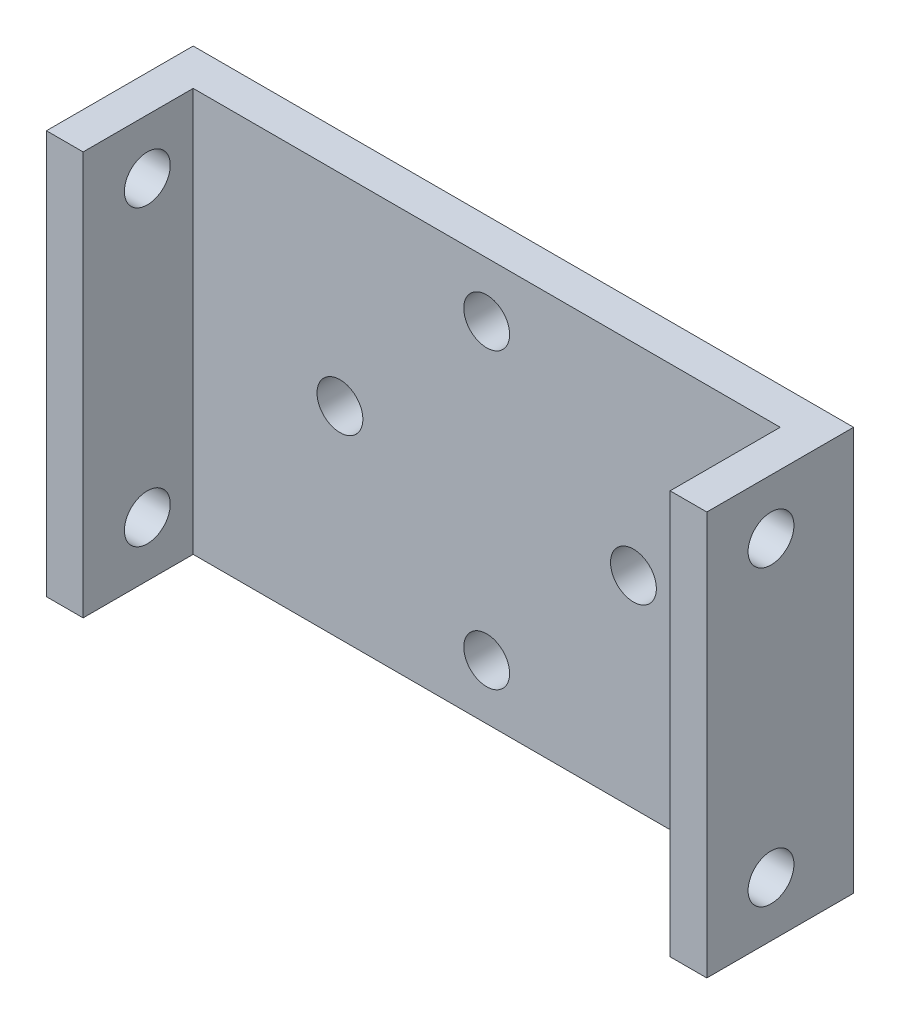
ISO-10303-21;
HEADER;
FILE_DESCRIPTION(('STEP AP214'),'2;1');
FILE_NAME('part.step','',(''),(''),'','','');
FILE_SCHEMA(('AUTOMOTIVE_DESIGN { 1 0 10303 214 1 1 1 1 }'));
ENDSEC;
DATA;
#1=APPLICATION_CONTEXT('core data for automotive mechanical design processes');
#2=APPLICATION_PROTOCOL_DEFINITION('international standard','automotive_design',2000,#1);
#3=PRODUCT_CONTEXT('',#1,'mechanical');
#4=PRODUCT('Part','Part','',(#3));
#5=PRODUCT_RELATED_PRODUCT_CATEGORY('part','',(#4));
#6=PRODUCT_DEFINITION_FORMATION('','',#4);
#7=PRODUCT_DEFINITION_CONTEXT('part definition',#1,'design');
#8=PRODUCT_DEFINITION('design','',#6,#7);
#9=PRODUCT_DEFINITION_SHAPE('','',#8);
#10=(LENGTH_UNIT() NAMED_UNIT(*) SI_UNIT(.MILLI.,.METRE.));
#11=(NAMED_UNIT(*) PLANE_ANGLE_UNIT() SI_UNIT($,.RADIAN.));
#12=(NAMED_UNIT(*) SI_UNIT($,.STERADIAN.) SOLID_ANGLE_UNIT());
#13=UNCERTAINTY_MEASURE_WITH_UNIT(LENGTH_MEASURE(1.E-05),#10,'distance_accuracy_value','');
#14=(GEOMETRIC_REPRESENTATION_CONTEXT(3) GLOBAL_UNCERTAINTY_ASSIGNED_CONTEXT((#13)) GLOBAL_UNIT_ASSIGNED_CONTEXT((#10,
#11,#12)) REPRESENTATION_CONTEXT('',''));
#15=CARTESIAN_POINT('',(0.,0.,0.));
#16=DIRECTION('',(0.,0.,1.));
#17=DIRECTION('',(1.,0.,0.));
#18=AXIS2_PLACEMENT_3D('',#15,#16,#17);
#19=CARTESIAN_POINT('',(0.,0.,2.));
#20=DIRECTION('',(0.,0.,-1.));
#21=DIRECTION('',(-1.,0.,0.));
#22=AXIS2_PLACEMENT_3D('',#19,#20,#21);
#23=PLANE('',#22);
#24=CARTESIAN_POINT('',(0.,8.,2.));
#25=DIRECTION('',(0.,0.,1.));
#26=DIRECTION('',(1.,0.,0.));
#27=AXIS2_PLACEMENT_3D('',#24,#25,#26);
#28=CIRCLE('',#27,1.25);
#29=CARTESIAN_POINT('',(1.25,8.,2.));
#30=VERTEX_POINT('',#29);
#31=EDGE_CURVE('E171',#30,#30,#28,.T.);
#32=ORIENTED_EDGE('',*,*,#31,.F.);
#33=EDGE_LOOP('',(#32));
#34=FACE_BOUND('',#33,.T.);
#35=CARTESIAN_POINT('',(8.,0.,2.));
#36=DIRECTION('',(0.,0.,1.));
#37=DIRECTION('',(1.,0.,0.));
#38=AXIS2_PLACEMENT_3D('',#35,#36,#37);
#39=CIRCLE('',#38,1.25);
#40=CARTESIAN_POINT('',(9.25,0.,2.));
#41=VERTEX_POINT('',#40);
#42=EDGE_CURVE('E165',#41,#41,#39,.T.);
#43=ORIENTED_EDGE('',*,*,#42,.F.);
#44=EDGE_LOOP('',(#43));
#45=FACE_BOUND('',#44,.T.);
#46=CARTESIAN_POINT('',(4.51808198568511E-13,-8.,2.));
#47=DIRECTION('',(0.,0.,1.));
#48=DIRECTION('',(1.,0.,0.));
#49=AXIS2_PLACEMENT_3D('',#46,#47,#48);
#50=CIRCLE('',#49,1.25000000000049);
#51=CARTESIAN_POINT('',(1.25000000000094,-8.,2.));
#52=VERTEX_POINT('',#51);
#53=EDGE_CURVE('E159',#52,#52,#50,.T.);
#54=ORIENTED_EDGE('',*,*,#53,.F.);
#55=EDGE_LOOP('',(#54));
#56=FACE_BOUND('',#55,.T.);
#57=CARTESIAN_POINT('',(-7.99999999999977,-2.26883816723573E-13,2.));
#58=DIRECTION('',(0.,0.,1.));
#59=DIRECTION('',(1.,0.,0.));
#60=AXIS2_PLACEMENT_3D('',#57,#58,#59);
#61=CIRCLE('',#60,1.25000000000036);
#62=CARTESIAN_POINT('',(-6.74999999999941,-2.26883816723573E-13,2.));
#63=VERTEX_POINT('',#62);
#64=EDGE_CURVE('E153',#63,#63,#61,.T.);
#65=ORIENTED_EDGE('',*,*,#64,.F.);
#66=EDGE_LOOP('',(#65));
#67=FACE_BOUND('',#66,.T.);
#68=DIRECTION('',(0.,-1.,0.));
#69=VECTOR('',#68,1.);
#70=CARTESIAN_POINT('',(16.,11.,2.));
#71=LINE('',#70,#69);
#72=CARTESIAN_POINT('',(16.,11.,2.));
#73=VERTEX_POINT('',#72);
#74=CARTESIAN_POINT('',(16.,-11.,2.));
#75=VERTEX_POINT('',#74);
#76=EDGE_CURVE('E53',#73,#75,#71,.T.);
#77=ORIENTED_EDGE('',*,*,#76,.F.);
#78=DIRECTION('',(-1.,0.,0.));
#79=VECTOR('',#78,1.);
#80=CARTESIAN_POINT('',(-18.,11.,2.));
#81=LINE('',#80,#79);
#82=CARTESIAN_POINT('',(-16.,11.,2.));
#83=VERTEX_POINT('',#82);
#84=EDGE_CURVE('E176',#73,#83,#81,.T.);
#85=ORIENTED_EDGE('',*,*,#84,.T.);
#86=DIRECTION('',(0.,1.,0.));
#87=VECTOR('',#86,1.);
#88=CARTESIAN_POINT('',(-16.,11.,2.));
#89=LINE('',#88,#87);
#90=CARTESIAN_POINT('',(-16.,-11.,2.));
#91=VERTEX_POINT('',#90);
#92=EDGE_CURVE('E133',#91,#83,#89,.T.);
#93=ORIENTED_EDGE('',*,*,#92,.F.);
#94=DIRECTION('',(1.,0.,0.));
#95=VECTOR('',#94,1.);
#96=CARTESIAN_POINT('',(-18.,-11.,2.));
#97=LINE('',#96,#95);
#98=EDGE_CURVE('E58',#91,#75,#97,.T.);
#99=ORIENTED_EDGE('',*,*,#98,.T.);
#100=EDGE_LOOP('',(#77,#85,#93,#99));
#101=FACE_BOUND('',#100,.T.);
#102=ADVANCED_FACE('F36',(#34,#45,#56,#67,#101),#23,.F.);
#103=CARTESIAN_POINT('',(0.,0.,0.));
#104=DIRECTION('',(0.,0.,-1.));
#105=DIRECTION('',(-1.,0.,0.));
#106=AXIS2_PLACEMENT_3D('',#103,#104,#105);
#107=PLANE('',#106);
#108=CARTESIAN_POINT('',(4.51808198568511E-13,-8.,0.));
#109=DIRECTION('',(0.,0.,1.));
#110=DIRECTION('',(1.,0.,0.));
#111=AXIS2_PLACEMENT_3D('',#108,#109,#110);
#112=CIRCLE('',#111,1.25000000000049);
#113=CARTESIAN_POINT('',(1.25000000000094,-8.,0.));
#114=VERTEX_POINT('',#113);
#115=EDGE_CURVE('E156',#114,#114,#112,.T.);
#116=ORIENTED_EDGE('',*,*,#115,.T.);
#117=EDGE_LOOP('',(#116));
#118=FACE_BOUND('',#117,.T.);
#119=CARTESIAN_POINT('',(0.,8.,0.));
#120=DIRECTION('',(0.,0.,1.));
#121=DIRECTION('',(1.,0.,0.));
#122=AXIS2_PLACEMENT_3D('',#119,#120,#121);
#123=CIRCLE('',#122,1.25);
#124=CARTESIAN_POINT('',(1.25,8.,0.));
#125=VERTEX_POINT('',#124);
#126=EDGE_CURVE('E168',#125,#125,#123,.T.);
#127=ORIENTED_EDGE('',*,*,#126,.T.);
#128=EDGE_LOOP('',(#127));
#129=FACE_BOUND('',#128,.T.);
#130=DIRECTION('',(0.,1.,0.));
#131=VECTOR('',#130,1.);
#132=CARTESIAN_POINT('',(18.,-11.,0.));
#133=LINE('',#132,#131);
#134=CARTESIAN_POINT('',(18.,-11.,0.));
#135=VERTEX_POINT('',#134);
#136=CARTESIAN_POINT('',(18.,11.,0.));
#137=VERTEX_POINT('',#136);
#138=EDGE_CURVE('E106',#135,#137,#133,.T.);
#139=ORIENTED_EDGE('',*,*,#138,.F.);
#140=DIRECTION('',(1.,0.,0.));
#141=VECTOR('',#140,1.);
#142=CARTESIAN_POINT('',(-18.,-11.,0.));
#143=LINE('',#142,#141);
#144=CARTESIAN_POINT('',(-18.,-11.,0.));
#145=VERTEX_POINT('',#144);
#146=EDGE_CURVE('E178',#145,#135,#143,.T.);
#147=ORIENTED_EDGE('',*,*,#146,.F.);
#148=DIRECTION('',(0.,-1.,0.));
#149=VECTOR('',#148,1.);
#150=CARTESIAN_POINT('',(-18.,-11.,0.));
#151=LINE('',#150,#149);
#152=CARTESIAN_POINT('',(-18.,11.,0.));
#153=VERTEX_POINT('',#152);
#154=EDGE_CURVE('E184',#153,#145,#151,.T.);
#155=ORIENTED_EDGE('',*,*,#154,.F.);
#156=DIRECTION('',(-1.,0.,0.));
#157=VECTOR('',#156,1.);
#158=CARTESIAN_POINT('',(-18.,11.,0.));
#159=LINE('',#158,#157);
#160=EDGE_CURVE('E182',#137,#153,#159,.T.);
#161=ORIENTED_EDGE('',*,*,#160,.F.);
#162=EDGE_LOOP('',(#139,#147,#155,#161));
#163=FACE_BOUND('',#162,.T.);
#164=CARTESIAN_POINT('',(8.,0.,0.));
#165=DIRECTION('',(0.,0.,1.));
#166=DIRECTION('',(1.,0.,0.));
#167=AXIS2_PLACEMENT_3D('',#164,#165,#166);
#168=CIRCLE('',#167,1.25);
#169=CARTESIAN_POINT('',(9.25,0.,0.));
#170=VERTEX_POINT('',#169);
#171=EDGE_CURVE('E162',#170,#170,#168,.T.);
#172=ORIENTED_EDGE('',*,*,#171,.T.);
#173=EDGE_LOOP('',(#172));
#174=FACE_BOUND('',#173,.T.);
#175=CARTESIAN_POINT('',(-7.99999999999977,-2.26883816723573E-13,0.));
#176=DIRECTION('',(0.,0.,1.));
#177=DIRECTION('',(1.,0.,0.));
#178=AXIS2_PLACEMENT_3D('',#175,#176,#177);
#179=CIRCLE('',#178,1.25000000000036);
#180=CARTESIAN_POINT('',(-6.74999999999941,-2.26883816723573E-13,0.));
#181=VERTEX_POINT('',#180);
#182=EDGE_CURVE('E152',#181,#181,#179,.T.);
#183=ORIENTED_EDGE('',*,*,#182,.T.);
#184=EDGE_LOOP('',(#183));
#185=FACE_BOUND('',#184,.T.);
#186=ADVANCED_FACE('F218',(#118,#129,#163,#174,#185),#107,.T.);
#187=CARTESIAN_POINT('',(18.,-11.,2.));
#188=DIRECTION('',(-1.,0.,0.));
#189=DIRECTION('',(0.,0.,1.));
#190=AXIS2_PLACEMENT_3D('',#187,#188,#189);
#191=PLANE('',#190);
#192=CARTESIAN_POINT('',(18.,8.,4.5));
#193=DIRECTION('',(-1.,0.,0.));
#194=DIRECTION('',(0.,0.,1.));
#195=AXIS2_PLACEMENT_3D('',#192,#193,#194);
#196=CIRCLE('',#195,1.25);
#197=CARTESIAN_POINT('',(18.,8.,5.75));
#198=VERTEX_POINT('',#197);
#199=EDGE_CURVE('E195',#198,#198,#196,.F.);
#200=ORIENTED_EDGE('',*,*,#199,.F.);
#201=EDGE_LOOP('',(#200));
#202=FACE_BOUND('',#201,.T.);
#203=CARTESIAN_POINT('',(18.,-8.,4.5));
#204=DIRECTION('',(-1.,0.,0.));
#205=DIRECTION('',(0.,0.,1.));
#206=AXIS2_PLACEMENT_3D('',#203,#204,#205);
#207=CIRCLE('',#206,1.25);
#208=CARTESIAN_POINT('',(18.,-8.,5.75));
#209=VERTEX_POINT('',#208);
#210=EDGE_CURVE('E205',#209,#209,#207,.F.);
#211=ORIENTED_EDGE('',*,*,#210,.F.);
#212=EDGE_LOOP('',(#211));
#213=FACE_BOUND('',#212,.T.);
#214=ORIENTED_EDGE('',*,*,#138,.T.);
#215=DIRECTION('',(0.,0.,-1.));
#216=VECTOR('',#215,1.);
#217=CARTESIAN_POINT('',(18.,11.,2.));
#218=LINE('',#217,#216);
#219=CARTESIAN_POINT('',(18.,11.,8.));
#220=VERTEX_POINT('',#219);
#221=EDGE_CURVE('E11',#220,#137,#218,.T.);
#222=ORIENTED_EDGE('',*,*,#221,.F.);
#223=DIRECTION('',(0.,1.,0.));
#224=VECTOR('',#223,1.);
#225=CARTESIAN_POINT('',(18.,11.,8.));
#226=LINE('',#225,#224);
#227=CARTESIAN_POINT('',(18.,-11.,8.));
#228=VERTEX_POINT('',#227);
#229=EDGE_CURVE('E104',#228,#220,#226,.T.);
#230=ORIENTED_EDGE('',*,*,#229,.F.);
#231=DIRECTION('',(0.,0.,-1.));
#232=VECTOR('',#231,1.);
#233=CARTESIAN_POINT('',(18.,-11.,2.));
#234=LINE('',#233,#232);
#235=EDGE_CURVE('E180',#228,#135,#234,.T.);
#236=ORIENTED_EDGE('',*,*,#235,.T.);
#237=EDGE_LOOP('',(#214,#222,#230,#236));
#238=FACE_BOUND('',#237,.T.);
#239=ADVANCED_FACE('F38',(#202,#213,#238),#191,.F.);
#240=CARTESIAN_POINT('',(-18.,11.,2.));
#241=DIRECTION('',(0.,-1.,0.));
#242=DIRECTION('',(0.,0.,-1.));
#243=AXIS2_PLACEMENT_3D('',#240,#241,#242);
#244=PLANE('',#243);
#245=ORIENTED_EDGE('',*,*,#160,.T.);
#246=DIRECTION('',(0.,0.,-1.));
#247=VECTOR('',#246,1.);
#248=CARTESIAN_POINT('',(-18.,11.,2.));
#249=LINE('',#248,#247);
#250=CARTESIAN_POINT('',(-18.,11.,8.));
#251=VERTEX_POINT('',#250);
#252=EDGE_CURVE('E45',#251,#153,#249,.T.);
#253=ORIENTED_EDGE('',*,*,#252,.F.);
#254=DIRECTION('',(-1.,0.,0.));
#255=VECTOR('',#254,1.);
#256=CARTESIAN_POINT('',(-18.,11.,8.));
#257=LINE('',#256,#255);
#258=CARTESIAN_POINT('',(-16.,11.,8.));
#259=VERTEX_POINT('',#258);
#260=EDGE_CURVE('E141',#259,#251,#257,.T.);
#261=ORIENTED_EDGE('',*,*,#260,.F.);
#262=DIRECTION('',(0.,0.,-1.));
#263=VECTOR('',#262,1.);
#264=CARTESIAN_POINT('',(-16.,11.,8.));
#265=LINE('',#264,#263);
#266=EDGE_CURVE('E144',#259,#83,#265,.T.);
#267=ORIENTED_EDGE('',*,*,#266,.T.);
#268=ORIENTED_EDGE('',*,*,#84,.F.);
#269=DIRECTION('',(0.,0.,-1.));
#270=VECTOR('',#269,1.);
#271=CARTESIAN_POINT('',(16.,11.,8.));
#272=LINE('',#271,#270);
#273=CARTESIAN_POINT('',(16.,11.,8.));
#274=VERTEX_POINT('',#273);
#275=EDGE_CURVE('E112',#274,#73,#272,.T.);
#276=ORIENTED_EDGE('',*,*,#275,.F.);
#277=DIRECTION('',(-1.,0.,0.));
#278=VECTOR('',#277,1.);
#279=CARTESIAN_POINT('',(18.,11.,8.));
#280=LINE('',#279,#278);
#281=EDGE_CURVE('E109',#220,#274,#280,.T.);
#282=ORIENTED_EDGE('',*,*,#281,.F.);
#283=ORIENTED_EDGE('',*,*,#221,.T.);
#284=EDGE_LOOP('',(#245,#253,#261,#267,#268,#276,#282,#283));
#285=FACE_BOUND('',#284,.T.);
#286=ADVANCED_FACE('F110',(#285),#244,.F.);
#287=CARTESIAN_POINT('',(-18.,-11.,2.));
#288=DIRECTION('',(1.,0.,0.));
#289=DIRECTION('',(0.,0.,-1.));
#290=AXIS2_PLACEMENT_3D('',#287,#288,#289);
#291=PLANE('',#290);
#292=CARTESIAN_POINT('',(-18.,8.,4.5));
#293=DIRECTION('',(-1.,0.,0.));
#294=DIRECTION('',(0.,0.,1.));
#295=AXIS2_PLACEMENT_3D('',#292,#293,#294);
#296=CIRCLE('',#295,1.25);
#297=CARTESIAN_POINT('',(-18.,8.,5.75));
#298=VERTEX_POINT('',#297);
#299=EDGE_CURVE('E200',#298,#298,#296,.T.);
#300=ORIENTED_EDGE('',*,*,#299,.F.);
#301=EDGE_LOOP('',(#300));
#302=FACE_BOUND('',#301,.T.);
#303=CARTESIAN_POINT('',(-18.,-8.,4.5));
#304=DIRECTION('',(-1.,0.,0.));
#305=DIRECTION('',(0.,0.,-1.));
#306=AXIS2_PLACEMENT_3D('',#303,#304,#305);
#307=CIRCLE('',#306,1.25);
#308=CARTESIAN_POINT('',(-18.,-8.,3.25));
#309=VERTEX_POINT('',#308);
#310=EDGE_CURVE('E208',#309,#309,#307,.T.);
#311=ORIENTED_EDGE('',*,*,#310,.F.);
#312=EDGE_LOOP('',(#311));
#313=FACE_BOUND('',#312,.T.);
#314=ORIENTED_EDGE('',*,*,#154,.T.);
#315=DIRECTION('',(0.,0.,-1.));
#316=VECTOR('',#315,1.);
#317=CARTESIAN_POINT('',(-18.,-11.,2.));
#318=LINE('',#317,#316);
#319=CARTESIAN_POINT('',(-18.,-11.,8.));
#320=VERTEX_POINT('',#319);
#321=EDGE_CURVE('E188',#320,#145,#318,.T.);
#322=ORIENTED_EDGE('',*,*,#321,.F.);
#323=DIRECTION('',(0.,-1.,0.));
#324=VECTOR('',#323,1.);
#325=CARTESIAN_POINT('',(-18.,11.,8.));
#326=LINE('',#325,#324);
#327=EDGE_CURVE('E134',#251,#320,#326,.T.);
#328=ORIENTED_EDGE('',*,*,#327,.F.);
#329=ORIENTED_EDGE('',*,*,#252,.T.);
#330=EDGE_LOOP('',(#314,#322,#328,#329));
#331=FACE_BOUND('',#330,.T.);
#332=ADVANCED_FACE('F224',(#302,#313,#331),#291,.F.);
#333=CARTESIAN_POINT('',(-18.,-11.,2.));
#334=DIRECTION('',(0.,1.,0.));
#335=DIRECTION('',(0.,0.,1.));
#336=AXIS2_PLACEMENT_3D('',#333,#334,#335);
#337=PLANE('',#336);
#338=ORIENTED_EDGE('',*,*,#146,.T.);
#339=ORIENTED_EDGE('',*,*,#235,.F.);
#340=DIRECTION('',(1.,0.,0.));
#341=VECTOR('',#340,1.);
#342=CARTESIAN_POINT('',(18.,-11.,8.));
#343=LINE('',#342,#341);
#344=CARTESIAN_POINT('',(16.,-11.,8.));
#345=VERTEX_POINT('',#344);
#346=EDGE_CURVE('E120',#345,#228,#343,.T.);
#347=ORIENTED_EDGE('',*,*,#346,.F.);
#348=DIRECTION('',(0.,0.,-1.));
#349=VECTOR('',#348,1.);
#350=CARTESIAN_POINT('',(16.,-11.,8.));
#351=LINE('',#350,#349);
#352=EDGE_CURVE('E128',#345,#75,#351,.T.);
#353=ORIENTED_EDGE('',*,*,#352,.T.);
#354=ORIENTED_EDGE('',*,*,#98,.F.);
#355=DIRECTION('',(0.,0.,-1.));
#356=VECTOR('',#355,1.);
#357=CARTESIAN_POINT('',(-16.,-11.,8.));
#358=LINE('',#357,#356);
#359=CARTESIAN_POINT('',(-16.,-11.,8.));
#360=VERTEX_POINT('',#359);
#361=EDGE_CURVE('E149',#360,#91,#358,.T.);
#362=ORIENTED_EDGE('',*,*,#361,.F.);
#363=DIRECTION('',(1.,0.,0.));
#364=VECTOR('',#363,1.);
#365=CARTESIAN_POINT('',(-18.,-11.,8.));
#366=LINE('',#365,#364);
#367=EDGE_CURVE('E137',#320,#360,#366,.T.);
#368=ORIENTED_EDGE('',*,*,#367,.F.);
#369=ORIENTED_EDGE('',*,*,#321,.T.);
#370=EDGE_LOOP('',(#338,#339,#347,#353,#354,#362,#368,#369));
#371=FACE_BOUND('',#370,.T.);
#372=ADVANCED_FACE('F238',(#371),#337,.F.);
#373=CARTESIAN_POINT('',(0.,8.,2.));
#374=DIRECTION('',(0.,0.,-1.));
#375=DIRECTION('',(-1.,0.,0.));
#376=AXIS2_PLACEMENT_3D('',#373,#374,#375);
#377=CYLINDRICAL_SURFACE('',#376,1.25);
#378=ORIENTED_EDGE('',*,*,#31,.T.);
#379=EDGE_LOOP('',(#378));
#380=FACE_BOUND('',#379,.T.);
#381=ORIENTED_EDGE('',*,*,#126,.F.);
#382=EDGE_LOOP('',(#381));
#383=FACE_BOUND('',#382,.T.);
#384=ADVANCED_FACE('F235',(#380,#383),#377,.F.);
#385=CARTESIAN_POINT('',(8.,0.,2.));
#386=DIRECTION('',(0.,0.,-1.));
#387=DIRECTION('',(-1.,0.,0.));
#388=AXIS2_PLACEMENT_3D('',#385,#386,#387);
#389=CYLINDRICAL_SURFACE('',#388,1.25);
#390=ORIENTED_EDGE('',*,*,#42,.T.);
#391=EDGE_LOOP('',(#390));
#392=FACE_BOUND('',#391,.T.);
#393=ORIENTED_EDGE('',*,*,#171,.F.);
#394=EDGE_LOOP('',(#393));
#395=FACE_BOUND('',#394,.T.);
#396=ADVANCED_FACE('F288',(#392,#395),#389,.F.);
#397=CARTESIAN_POINT('',(4.51808198568511E-13,-8.,2.));
#398=DIRECTION('',(0.,0.,-1.));
#399=DIRECTION('',(-1.,0.,0.));
#400=AXIS2_PLACEMENT_3D('',#397,#398,#399);
#401=CYLINDRICAL_SURFACE('',#400,1.25000000000049);
#402=ORIENTED_EDGE('',*,*,#53,.T.);
#403=EDGE_LOOP('',(#402));
#404=FACE_BOUND('',#403,.T.);
#405=ORIENTED_EDGE('',*,*,#115,.F.);
#406=EDGE_LOOP('',(#405));
#407=FACE_BOUND('',#406,.T.);
#408=ADVANCED_FACE('F285',(#404,#407),#401,.F.);
#409=CARTESIAN_POINT('',(-7.99999999999977,-2.26883816723573E-13,2.));
#410=DIRECTION('',(0.,0.,-1.));
#411=DIRECTION('',(-1.,0.,0.));
#412=AXIS2_PLACEMENT_3D('',#409,#410,#411);
#413=CYLINDRICAL_SURFACE('',#412,1.25000000000036);
#414=ORIENTED_EDGE('',*,*,#64,.T.);
#415=EDGE_LOOP('',(#414));
#416=FACE_BOUND('',#415,.T.);
#417=ORIENTED_EDGE('',*,*,#182,.F.);
#418=EDGE_LOOP('',(#417));
#419=FACE_BOUND('',#418,.T.);
#420=ADVANCED_FACE('F281',(#416,#419),#413,.F.);
#421=CARTESIAN_POINT('',(-16.,11.,8.));
#422=DIRECTION('',(-1.,0.,0.));
#423=DIRECTION('',(0.,-1.,0.));
#424=AXIS2_PLACEMENT_3D('',#421,#422,#423);
#425=PLANE('',#424);
#426=CARTESIAN_POINT('',(-16.,8.,4.5));
#427=DIRECTION('',(-1.,0.,0.));
#428=DIRECTION('',(0.,-1.,0.));
#429=AXIS2_PLACEMENT_3D('',#426,#427,#428);
#430=CIRCLE('',#429,1.25);
#431=CARTESIAN_POINT('',(-16.,6.75,4.5));
#432=VERTEX_POINT('',#431);
#433=EDGE_CURVE('E122',#432,#432,#430,.T.);
#434=ORIENTED_EDGE('',*,*,#433,.T.);
#435=EDGE_LOOP('',(#434));
#436=FACE_BOUND('',#435,.T.);
#437=CARTESIAN_POINT('',(-16.,-8.,4.5));
#438=DIRECTION('',(-1.,0.,0.));
#439=DIRECTION('',(0.,-1.,0.));
#440=AXIS2_PLACEMENT_3D('',#437,#438,#439);
#441=CIRCLE('',#440,1.25);
#442=CARTESIAN_POINT('',(-16.,-9.25,4.5));
#443=VERTEX_POINT('',#442);
#444=EDGE_CURVE('E194',#443,#443,#441,.T.);
#445=ORIENTED_EDGE('',*,*,#444,.T.);
#446=EDGE_LOOP('',(#445));
#447=FACE_BOUND('',#446,.T.);
#448=ORIENTED_EDGE('',*,*,#92,.T.);
#449=ORIENTED_EDGE('',*,*,#266,.F.);
#450=DIRECTION('',(0.,1.,0.));
#451=VECTOR('',#450,1.);
#452=CARTESIAN_POINT('',(-16.,11.,8.));
#453=LINE('',#452,#451);
#454=EDGE_CURVE('E139',#360,#259,#453,.T.);
#455=ORIENTED_EDGE('',*,*,#454,.F.);
#456=ORIENTED_EDGE('',*,*,#361,.T.);
#457=EDGE_LOOP('',(#448,#449,#455,#456));
#458=FACE_BOUND('',#457,.T.);
#459=ADVANCED_FACE('F263',(#436,#447,#458),#425,.F.);
#460=CARTESIAN_POINT('',(0.,0.,8.));
#461=DIRECTION('',(0.,0.,1.));
#462=DIRECTION('',(1.,0.,0.));
#463=AXIS2_PLACEMENT_3D('',#460,#461,#462);
#464=PLANE('',#463);
#465=ORIENTED_EDGE('',*,*,#327,.T.);
#466=ORIENTED_EDGE('',*,*,#367,.T.);
#467=ORIENTED_EDGE('',*,*,#454,.T.);
#468=ORIENTED_EDGE('',*,*,#260,.T.);
#469=EDGE_LOOP('',(#465,#466,#467,#468));
#470=FACE_BOUND('',#469,.T.);
#471=ADVANCED_FACE('F259',(#470),#464,.T.);
#472=CARTESIAN_POINT('',(16.,11.,8.));
#473=DIRECTION('',(1.,0.,0.));
#474=DIRECTION('',(0.,1.,0.));
#475=AXIS2_PLACEMENT_3D('',#472,#473,#474);
#476=PLANE('',#475);
#477=CARTESIAN_POINT('',(16.,8.,4.5));
#478=DIRECTION('',(1.,0.,0.));
#479=DIRECTION('',(0.,1.,0.));
#480=AXIS2_PLACEMENT_3D('',#477,#478,#479);
#481=CIRCLE('',#480,1.25);
#482=CARTESIAN_POINT('',(16.,9.25,4.5));
#483=VERTEX_POINT('',#482);
#484=EDGE_CURVE('E40',#483,#483,#481,.T.);
#485=ORIENTED_EDGE('',*,*,#484,.T.);
#486=EDGE_LOOP('',(#485));
#487=FACE_BOUND('',#486,.T.);
#488=CARTESIAN_POINT('',(16.,-8.,4.5));
#489=DIRECTION('',(1.,0.,0.));
#490=DIRECTION('',(0.,1.,0.));
#491=AXIS2_PLACEMENT_3D('',#488,#489,#490);
#492=CIRCLE('',#491,1.25);
#493=CARTESIAN_POINT('',(16.,-6.75,4.5));
#494=VERTEX_POINT('',#493);
#495=EDGE_CURVE('E192',#494,#494,#492,.T.);
#496=ORIENTED_EDGE('',*,*,#495,.T.);
#497=EDGE_LOOP('',(#496));
#498=FACE_BOUND('',#497,.T.);
#499=ORIENTED_EDGE('',*,*,#76,.T.);
#500=ORIENTED_EDGE('',*,*,#352,.F.);
#501=DIRECTION('',(0.,-1.,0.));
#502=VECTOR('',#501,1.);
#503=CARTESIAN_POINT('',(16.,11.,8.));
#504=LINE('',#503,#502);
#505=EDGE_CURVE('E115',#274,#345,#504,.T.);
#506=ORIENTED_EDGE('',*,*,#505,.F.);
#507=ORIENTED_EDGE('',*,*,#275,.T.);
#508=EDGE_LOOP('',(#499,#500,#506,#507));
#509=FACE_BOUND('',#508,.T.);
#510=ADVANCED_FACE('F265',(#487,#498,#509),#476,.F.);
#511=CARTESIAN_POINT('',(0.,0.,8.));
#512=DIRECTION('',(0.,0.,-1.));
#513=DIRECTION('',(-1.,0.,0.));
#514=AXIS2_PLACEMENT_3D('',#511,#512,#513);
#515=PLANE('',#514);
#516=ORIENTED_EDGE('',*,*,#229,.T.);
#517=ORIENTED_EDGE('',*,*,#281,.T.);
#518=ORIENTED_EDGE('',*,*,#505,.T.);
#519=ORIENTED_EDGE('',*,*,#346,.T.);
#520=EDGE_LOOP('',(#516,#517,#518,#519));
#521=FACE_BOUND('',#520,.T.);
#522=ADVANCED_FACE('F118',(#521),#515,.F.);
#523=CARTESIAN_POINT('',(21.5355339059327,-8.,4.5));
#524=DIRECTION('',(-1.,0.,0.));
#525=DIRECTION('',(0.,0.,1.));
#526=AXIS2_PLACEMENT_3D('',#523,#524,#525);
#527=CYLINDRICAL_SURFACE('',#526,1.25);
#528=ORIENTED_EDGE('',*,*,#210,.T.);
#529=EDGE_LOOP('',(#528));
#530=FACE_BOUND('',#529,.T.);
#531=ORIENTED_EDGE('',*,*,#495,.F.);
#532=EDGE_LOOP('',(#531));
#533=FACE_BOUND('',#532,.T.);
#534=ADVANCED_FACE('F214',(#530,#533),#527,.F.);
#535=CARTESIAN_POINT('',(21.5355339059327,8.,4.5));
#536=DIRECTION('',(-1.,0.,0.));
#537=DIRECTION('',(0.,0.,1.));
#538=AXIS2_PLACEMENT_3D('',#535,#536,#537);
#539=CYLINDRICAL_SURFACE('',#538,1.25);
#540=ORIENTED_EDGE('',*,*,#199,.T.);
#541=EDGE_LOOP('',(#540));
#542=FACE_BOUND('',#541,.T.);
#543=ORIENTED_EDGE('',*,*,#484,.F.);
#544=EDGE_LOOP('',(#543));
#545=FACE_BOUND('',#544,.T.);
#546=ADVANCED_FACE('F365',(#542,#545),#539,.F.);
#547=ORIENTED_EDGE('',*,*,#310,.T.);
#548=EDGE_LOOP('',(#547));
#549=FACE_BOUND('',#548,.T.);
#550=ORIENTED_EDGE('',*,*,#444,.F.);
#551=EDGE_LOOP('',(#550));
#552=FACE_BOUND('',#551,.T.);
#553=ADVANCED_FACE('F366',(#549,#552),#527,.F.);
#554=ORIENTED_EDGE('',*,*,#299,.T.);
#555=EDGE_LOOP('',(#554));
#556=FACE_BOUND('',#555,.T.);
#557=ORIENTED_EDGE('',*,*,#433,.F.);
#558=EDGE_LOOP('',(#557));
#559=FACE_BOUND('',#558,.T.);
#560=ADVANCED_FACE('F375',(#556,#559),#539,.F.);
#561=CLOSED_SHELL('',(#102,#186,#239,#286,#332,#372,#384,#396,#408,#420,#459,#471,#510,#522,
#534,#546,#553,#560));
#562=MANIFOLD_SOLID_BREP('B2',#561);
#563=ADVANCED_BREP_SHAPE_REPRESENTATION('',(#18,#562),#14);
#564=SHAPE_DEFINITION_REPRESENTATION(#9,#563);
ENDSEC;
END-ISO-10303-21;
